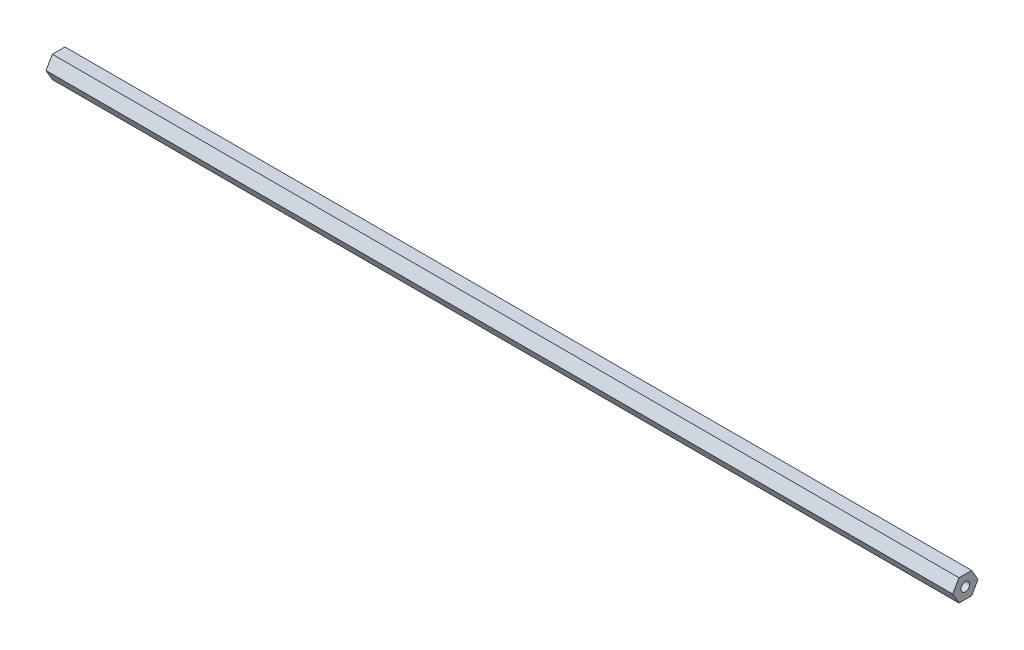
ISO-10303-21;
HEADER;
FILE_DESCRIPTION(('STEP AP214'),'2;1');
FILE_NAME('part.step','',(''),(''),'','','');
FILE_SCHEMA(('AUTOMOTIVE_DESIGN { 1 0 10303 214 1 1 1 1 }'));
ENDSEC;
DATA;
#1=APPLICATION_CONTEXT('core data for automotive mechanical design processes');
#2=APPLICATION_PROTOCOL_DEFINITION('international standard','automotive_design',2000,#1);
#3=PRODUCT_CONTEXT('',#1,'mechanical');
#4=PRODUCT('Part','Part','',(#3));
#5=PRODUCT_RELATED_PRODUCT_CATEGORY('part','',(#4));
#6=PRODUCT_DEFINITION_FORMATION('','',#4);
#7=PRODUCT_DEFINITION_CONTEXT('part definition',#1,'design');
#8=PRODUCT_DEFINITION('design','',#6,#7);
#9=PRODUCT_DEFINITION_SHAPE('','',#8);
#10=(LENGTH_UNIT() NAMED_UNIT(*) SI_UNIT(.MILLI.,.METRE.));
#11=(NAMED_UNIT(*) PLANE_ANGLE_UNIT() SI_UNIT($,.RADIAN.));
#12=(NAMED_UNIT(*) SI_UNIT($,.STERADIAN.) SOLID_ANGLE_UNIT());
#13=UNCERTAINTY_MEASURE_WITH_UNIT(LENGTH_MEASURE(1.E-05),#10,'distance_accuracy_value','');
#14=(GEOMETRIC_REPRESENTATION_CONTEXT(3) GLOBAL_UNCERTAINTY_ASSIGNED_CONTEXT((#13)) GLOBAL_UNIT_ASSIGNED_CONTEXT((#10,
#11,#12)) REPRESENTATION_CONTEXT('',''));
#15=CARTESIAN_POINT('',(0.,0.,0.));
#16=DIRECTION('',(0.,0.,1.));
#17=DIRECTION('',(1.,0.,0.));
#18=AXIS2_PLACEMENT_3D('',#15,#16,#17);
#19=CARTESIAN_POINT('',(525.4625,-6.34999999999993,-3.66617420935418));
#20=DIRECTION('',(0.,0.499999999999995,0.866025403784441));
#21=DIRECTION('',(0.,-0.866025403784441,0.499999999999995));
#22=AXIS2_PLACEMENT_3D('',#19,#20,#21);
#23=PLANE('',#22);
#24=DIRECTION('',(0.,0.866025403784441,-0.499999999999995));
#25=VECTOR('',#24,1.);
#26=CARTESIAN_POINT('',(0.,-6.34999999999993,-3.66617420935418));
#27=LINE('',#26,#25);
#28=CARTESIAN_POINT('',(0.,-6.34999999999993,-3.66617420935418));
#29=VERTEX_POINT('',#28);
#30=CARTESIAN_POINT('',(0.,0.,-7.33234841870822));
#31=VERTEX_POINT('',#30);
#32=EDGE_CURVE('E135',#29,#31,#27,.T.);
#33=ORIENTED_EDGE('',*,*,#32,.T.);
#34=DIRECTION('',(-1.,0.,0.));
#35=VECTOR('',#34,1.);
#36=CARTESIAN_POINT('',(525.4625,0.,-7.33234841870822));
#37=LINE('',#36,#35);
#38=CARTESIAN_POINT('',(525.4625,0.,-7.33234841870822));
#39=VERTEX_POINT('',#38);
#40=EDGE_CURVE('E11',#39,#31,#37,.T.);
#41=ORIENTED_EDGE('',*,*,#40,.F.);
#42=DIRECTION('',(0.,0.866025403784441,-0.499999999999995));
#43=VECTOR('',#42,1.);
#44=CARTESIAN_POINT('',(525.4625,-6.34999999999993,-3.66617420935418));
#45=LINE('',#44,#43);
#46=CARTESIAN_POINT('',(525.4625,-6.34999999999993,-3.66617420935418));
#47=VERTEX_POINT('',#46);
#48=EDGE_CURVE('E152',#47,#39,#45,.T.);
#49=ORIENTED_EDGE('',*,*,#48,.F.);
#50=DIRECTION('',(-1.,0.,0.));
#51=VECTOR('',#50,1.);
#52=CARTESIAN_POINT('',(525.4625,-6.34999999999993,-3.66617420935418));
#53=LINE('',#52,#51);
#54=EDGE_CURVE('E131',#47,#29,#53,.T.);
#55=ORIENTED_EDGE('',*,*,#54,.T.);
#56=EDGE_LOOP('',(#33,#41,#49,#55));
#57=FACE_BOUND('',#56,.T.);
#58=ADVANCED_FACE('F42',(#57),#23,.F.);
#59=CARTESIAN_POINT('',(525.4625,0.,-7.33234841870822));
#60=DIRECTION('',(0.,-0.500000000000001,0.866025403784438));
#61=DIRECTION('',(0.,-0.866025403784438,-0.500000000000001));
#62=AXIS2_PLACEMENT_3D('',#59,#60,#61);
#63=PLANE('',#62);
#64=DIRECTION('',(0.,0.866025403784438,0.500000000000001));
#65=VECTOR('',#64,1.);
#66=CARTESIAN_POINT('',(0.,0.,-7.33234841870822));
#67=LINE('',#66,#65);
#68=CARTESIAN_POINT('',(0.,6.34999999999999,-3.6661742093541));
#69=VERTEX_POINT('',#68);
#70=EDGE_CURVE('E139',#31,#69,#67,.T.);
#71=ORIENTED_EDGE('',*,*,#70,.T.);
#72=DIRECTION('',(-1.,0.,0.));
#73=VECTOR('',#72,1.);
#74=CARTESIAN_POINT('',(525.4625,6.34999999999999,-3.6661742093541));
#75=LINE('',#74,#73);
#76=CARTESIAN_POINT('',(525.4625,6.34999999999999,-3.6661742093541));
#77=VERTEX_POINT('',#76);
#78=EDGE_CURVE('E51',#77,#69,#75,.T.);
#79=ORIENTED_EDGE('',*,*,#78,.F.);
#80=DIRECTION('',(0.,0.866025403784438,0.500000000000001));
#81=VECTOR('',#80,1.);
#82=CARTESIAN_POINT('',(525.4625,0.,-7.33234841870822));
#83=LINE('',#82,#81);
#84=EDGE_CURVE('E97',#39,#77,#83,.T.);
#85=ORIENTED_EDGE('',*,*,#84,.F.);
#86=ORIENTED_EDGE('',*,*,#40,.T.);
#87=EDGE_LOOP('',(#71,#79,#85,#86));
#88=FACE_BOUND('',#87,.T.);
#89=ADVANCED_FACE('F182',(#88),#63,.F.);
#90=CARTESIAN_POINT('',(525.4625,6.34999999999999,-3.6661742093541));
#91=DIRECTION('',(0.,-1.,0.));
#92=DIRECTION('',(0.,0.,-1.));
#93=AXIS2_PLACEMENT_3D('',#90,#91,#92);
#94=PLANE('',#93);
#95=DIRECTION('',(0.,0.,1.));
#96=VECTOR('',#95,1.);
#97=CARTESIAN_POINT('',(0.,6.34999999999999,-3.6661742093541));
#98=LINE('',#97,#96);
#99=CARTESIAN_POINT('',(0.,6.34999999999996,3.66617420935414));
#100=VERTEX_POINT('',#99);
#101=EDGE_CURVE('E143',#69,#100,#98,.T.);
#102=ORIENTED_EDGE('',*,*,#101,.T.);
#103=DIRECTION('',(-1.,0.,0.));
#104=VECTOR('',#103,1.);
#105=CARTESIAN_POINT('',(525.4625,6.34999999999996,3.66617420935414));
#106=LINE('',#105,#104);
#107=CARTESIAN_POINT('',(525.4625,6.34999999999996,3.66617420935414));
#108=VERTEX_POINT('',#107);
#109=EDGE_CURVE('E123',#108,#100,#106,.T.);
#110=ORIENTED_EDGE('',*,*,#109,.F.);
#111=DIRECTION('',(0.,0.,1.));
#112=VECTOR('',#111,1.);
#113=CARTESIAN_POINT('',(525.4625,6.34999999999999,-3.6661742093541));
#114=LINE('',#113,#112);
#115=EDGE_CURVE('E112',#77,#108,#114,.T.);
#116=ORIENTED_EDGE('',*,*,#115,.F.);
#117=ORIENTED_EDGE('',*,*,#78,.T.);
#118=EDGE_LOOP('',(#102,#110,#116,#117));
#119=FACE_BOUND('',#118,.T.);
#120=ADVANCED_FACE('F163',(#119),#94,.F.);
#121=CARTESIAN_POINT('',(525.4625,6.34999999999996,3.66617420935414));
#122=DIRECTION('',(0.,-0.499999999999995,-0.866025403784442));
#123=DIRECTION('',(0.,0.866025403784442,-0.499999999999995));
#124=AXIS2_PLACEMENT_3D('',#121,#122,#123);
#125=PLANE('',#124);
#126=DIRECTION('',(0.,-0.866025403784442,0.499999999999995));
#127=VECTOR('',#126,1.);
#128=CARTESIAN_POINT('',(0.,6.34999999999996,3.66617420935414));
#129=LINE('',#128,#127);
#130=CARTESIAN_POINT('',(0.,0.,7.33234841870822));
#131=VERTEX_POINT('',#130);
#132=EDGE_CURVE('E121',#100,#131,#129,.T.);
#133=ORIENTED_EDGE('',*,*,#132,.T.);
#134=DIRECTION('',(-1.,0.,0.));
#135=VECTOR('',#134,1.);
#136=CARTESIAN_POINT('',(525.4625,0.,7.33234841870822));
#137=LINE('',#136,#135);
#138=CARTESIAN_POINT('',(525.4625,0.,7.33234841870822));
#139=VERTEX_POINT('',#138);
#140=EDGE_CURVE('E118',#139,#131,#137,.T.);
#141=ORIENTED_EDGE('',*,*,#140,.F.);
#142=DIRECTION('',(0.,-0.866025403784442,0.499999999999995));
#143=VECTOR('',#142,1.);
#144=CARTESIAN_POINT('',(525.4625,6.34999999999996,3.66617420935414));
#145=LINE('',#144,#143);
#146=EDGE_CURVE('E106',#108,#139,#145,.T.);
#147=ORIENTED_EDGE('',*,*,#146,.F.);
#148=ORIENTED_EDGE('',*,*,#109,.T.);
#149=EDGE_LOOP('',(#133,#141,#147,#148));
#150=FACE_BOUND('',#149,.T.);
#151=ADVANCED_FACE('F119',(#150),#125,.F.);
#152=CARTESIAN_POINT('',(525.4625,0.,7.33234841870822));
#153=DIRECTION('',(0.,0.500000000000007,-0.866025403784434));
#154=DIRECTION('',(0.,0.866025403784435,0.500000000000007));
#155=AXIS2_PLACEMENT_3D('',#152,#153,#154);
#156=PLANE('',#155);
#157=DIRECTION('',(0.,-0.866025403784434,-0.500000000000007));
#158=VECTOR('',#157,1.);
#159=CARTESIAN_POINT('',(0.,0.,7.33234841870822));
#160=LINE('',#159,#158);
#161=CARTESIAN_POINT('',(0.,-6.35000000000001,3.66617420935405));
#162=VERTEX_POINT('',#161);
#163=EDGE_CURVE('E83',#131,#162,#160,.T.);
#164=ORIENTED_EDGE('',*,*,#163,.T.);
#165=DIRECTION('',(-1.,0.,0.));
#166=VECTOR('',#165,1.);
#167=CARTESIAN_POINT('',(525.4625,-6.35000000000001,3.66617420935405));
#168=LINE('',#167,#166);
#169=CARTESIAN_POINT('',(525.4625,-6.35000000000001,3.66617420935405));
#170=VERTEX_POINT('',#169);
#171=EDGE_CURVE('E124',#170,#162,#168,.T.);
#172=ORIENTED_EDGE('',*,*,#171,.F.);
#173=DIRECTION('',(0.,-0.866025403784434,-0.500000000000007));
#174=VECTOR('',#173,1.);
#175=CARTESIAN_POINT('',(525.4625,0.,7.33234841870822));
#176=LINE('',#175,#174);
#177=EDGE_CURVE('E110',#139,#170,#176,.T.);
#178=ORIENTED_EDGE('',*,*,#177,.F.);
#179=ORIENTED_EDGE('',*,*,#140,.T.);
#180=EDGE_LOOP('',(#164,#172,#178,#179));
#181=FACE_BOUND('',#180,.T.);
#182=ADVANCED_FACE('F126',(#181),#156,.F.);
#183=CARTESIAN_POINT('',(525.4625,-6.35000000000001,3.66617420935405));
#184=DIRECTION('',(0.,1.,0.));
#185=DIRECTION('',(0.,0.,1.));
#186=AXIS2_PLACEMENT_3D('',#183,#184,#185);
#187=PLANE('',#186);
#188=DIRECTION('',(0.,0.,-1.));
#189=VECTOR('',#188,1.);
#190=CARTESIAN_POINT('',(0.,-6.35000000000001,3.66617420935405));
#191=LINE('',#190,#189);
#192=EDGE_CURVE('E89',#162,#29,#191,.T.);
#193=ORIENTED_EDGE('',*,*,#192,.T.);
#194=ORIENTED_EDGE('',*,*,#54,.F.);
#195=DIRECTION('',(0.,0.,-1.));
#196=VECTOR('',#195,1.);
#197=CARTESIAN_POINT('',(525.4625,-6.35000000000001,3.66617420935405));
#198=LINE('',#197,#196);
#199=EDGE_CURVE('E59',#170,#47,#198,.T.);
#200=ORIENTED_EDGE('',*,*,#199,.F.);
#201=ORIENTED_EDGE('',*,*,#171,.T.);
#202=EDGE_LOOP('',(#193,#194,#200,#201));
#203=FACE_BOUND('',#202,.T.);
#204=ADVANCED_FACE('F170',(#203),#187,.F.);
#205=CARTESIAN_POINT('',(525.4625,0.,0.));
#206=DIRECTION('',(1.,0.,0.));
#207=DIRECTION('',(0.,0.,-1.));
#208=AXIS2_PLACEMENT_3D('',#205,#206,#207);
#209=PLANE('',#208);
#210=CARTESIAN_POINT('',(525.4625,0.,0.));
#211=DIRECTION('',(1.,0.,0.));
#212=DIRECTION('',(0.,0.,-1.));
#213=AXIS2_PLACEMENT_3D('',#210,#211,#212);
#214=CIRCLE('',#213,2.55269999999999);
#215=CARTESIAN_POINT('',(525.4625,0.,-2.55269999999999));
#216=VERTEX_POINT('',#215);
#217=EDGE_CURVE('E318',#216,#216,#214,.T.);
#218=ORIENTED_EDGE('',*,*,#217,.F.);
#219=EDGE_LOOP('',(#218));
#220=FACE_BOUND('',#219,.T.);
#221=ORIENTED_EDGE('',*,*,#48,.T.);
#222=ORIENTED_EDGE('',*,*,#84,.T.);
#223=ORIENTED_EDGE('',*,*,#115,.T.);
#224=ORIENTED_EDGE('',*,*,#146,.T.);
#225=ORIENTED_EDGE('',*,*,#177,.T.);
#226=ORIENTED_EDGE('',*,*,#199,.T.);
#227=EDGE_LOOP('',(#221,#222,#223,#224,#225,#226));
#228=FACE_BOUND('',#227,.T.);
#229=ADVANCED_FACE('F108',(#220,#228),#209,.T.);
#230=CARTESIAN_POINT('',(0.,0.,0.));
#231=DIRECTION('',(1.,0.,0.));
#232=DIRECTION('',(0.,0.,-1.));
#233=AXIS2_PLACEMENT_3D('',#230,#231,#232);
#234=PLANE('',#233);
#235=CARTESIAN_POINT('',(0.,0.,0.));
#236=DIRECTION('',(-1.,0.,0.));
#237=DIRECTION('',(0.,0.,1.));
#238=AXIS2_PLACEMENT_3D('',#235,#236,#237);
#239=CIRCLE('',#238,2.55269999999999);
#240=CARTESIAN_POINT('',(0.,0.,2.55269999999999));
#241=VERTEX_POINT('',#240);
#242=EDGE_CURVE('E313',#241,#241,#239,.T.);
#243=ORIENTED_EDGE('',*,*,#242,.F.);
#244=EDGE_LOOP('',(#243));
#245=FACE_BOUND('',#244,.T.);
#246=ORIENTED_EDGE('',*,*,#32,.F.);
#247=ORIENTED_EDGE('',*,*,#192,.F.);
#248=ORIENTED_EDGE('',*,*,#163,.F.);
#249=ORIENTED_EDGE('',*,*,#132,.F.);
#250=ORIENTED_EDGE('',*,*,#101,.F.);
#251=ORIENTED_EDGE('',*,*,#70,.F.);
#252=EDGE_LOOP('',(#246,#247,#248,#249,#250,#251));
#253=FACE_BOUND('',#252,.T.);
#254=ADVANCED_FACE('F166',(#245,#253),#234,.F.);
#255=CARTESIAN_POINT('',(508.9525,0.,0.));
#256=DIRECTION('',(1.,0.,0.));
#257=DIRECTION('',(0.,0.,-1.));
#258=AXIS2_PLACEMENT_3D('',#255,#256,#257);
#259=CONICAL_SURFACE('',#258,2.55269999999999,1.02974425867664);
#260=CARTESIAN_POINT('',(507.418683097808,0.,0.));
#261=VERTEX_POINT('',#260);
#262=VERTEX_LOOP('',#261);
#263=FACE_BOUND('',#262,.T.);
#264=CARTESIAN_POINT('',(508.9525,0.,0.));
#265=DIRECTION('',(1.,0.,0.));
#266=DIRECTION('',(0.,0.,-1.));
#267=AXIS2_PLACEMENT_3D('',#264,#265,#266);
#268=CIRCLE('',#267,2.55269999999999);
#269=CARTESIAN_POINT('',(508.9525,0.,-2.55269999999999));
#270=VERTEX_POINT('',#269);
#271=EDGE_CURVE('E140',#270,#270,#268,.T.);
#272=ORIENTED_EDGE('',*,*,#271,.T.);
#273=EDGE_LOOP('',(#272));
#274=FACE_BOUND('',#273,.T.);
#275=ADVANCED_FACE('F220',(#263,#274),#259,.F.);
#276=CARTESIAN_POINT('',(525.4625,0.,0.));
#277=DIRECTION('',(1.,0.,0.));
#278=DIRECTION('',(0.,0.,-1.));
#279=AXIS2_PLACEMENT_3D('',#276,#277,#278);
#280=CYLINDRICAL_SURFACE('',#279,2.55269999999999);
#281=ORIENTED_EDGE('',*,*,#271,.F.);
#282=EDGE_LOOP('',(#281));
#283=FACE_BOUND('',#282,.T.);
#284=ORIENTED_EDGE('',*,*,#217,.T.);
#285=EDGE_LOOP('',(#284));
#286=FACE_BOUND('',#285,.T.);
#287=ADVANCED_FACE('F230',(#283,#286),#280,.F.);
#288=CARTESIAN_POINT('',(16.51,0.,0.));
#289=DIRECTION('',(-1.,0.,0.));
#290=DIRECTION('',(0.,0.,1.));
#291=AXIS2_PLACEMENT_3D('',#288,#289,#290);
#292=CONICAL_SURFACE('',#291,2.55269999999999,1.02974425867665);
#293=CARTESIAN_POINT('',(18.0438169021916,0.,0.));
#294=VERTEX_POINT('',#293);
#295=VERTEX_LOOP('',#294);
#296=FACE_BOUND('',#295,.T.);
#297=CARTESIAN_POINT('',(16.51,0.,0.));
#298=DIRECTION('',(-1.,0.,0.));
#299=DIRECTION('',(0.,0.,1.));
#300=AXIS2_PLACEMENT_3D('',#297,#298,#299);
#301=CIRCLE('',#300,2.55269999999999);
#302=CARTESIAN_POINT('',(16.51,0.,2.55269999999999));
#303=VERTEX_POINT('',#302);
#304=EDGE_CURVE('E310',#303,#303,#301,.T.);
#305=ORIENTED_EDGE('',*,*,#304,.T.);
#306=EDGE_LOOP('',(#305));
#307=FACE_BOUND('',#306,.T.);
#308=ADVANCED_FACE('F241',(#296,#307),#292,.F.);
#309=CARTESIAN_POINT('',(0.,0.,0.));
#310=DIRECTION('',(-1.,0.,0.));
#311=DIRECTION('',(0.,0.,1.));
#312=AXIS2_PLACEMENT_3D('',#309,#310,#311);
#313=CYLINDRICAL_SURFACE('',#312,2.55269999999999);
#314=ORIENTED_EDGE('',*,*,#304,.F.);
#315=EDGE_LOOP('',(#314));
#316=FACE_BOUND('',#315,.T.);
#317=ORIENTED_EDGE('',*,*,#242,.T.);
#318=EDGE_LOOP('',(#317));
#319=FACE_BOUND('',#318,.T.);
#320=ADVANCED_FACE('F251',(#316,#319),#313,.F.);
#321=CLOSED_SHELL('',(#58,#89,#120,#151,#182,#204,#229,#254,#275,#287,#308,#320));
#322=MANIFOLD_SOLID_BREP('B2',#321);
#323=ADVANCED_BREP_SHAPE_REPRESENTATION('',(#18,#322),#14);
#324=SHAPE_DEFINITION_REPRESENTATION(#9,#323);
ENDSEC;
END-ISO-10303-21;
